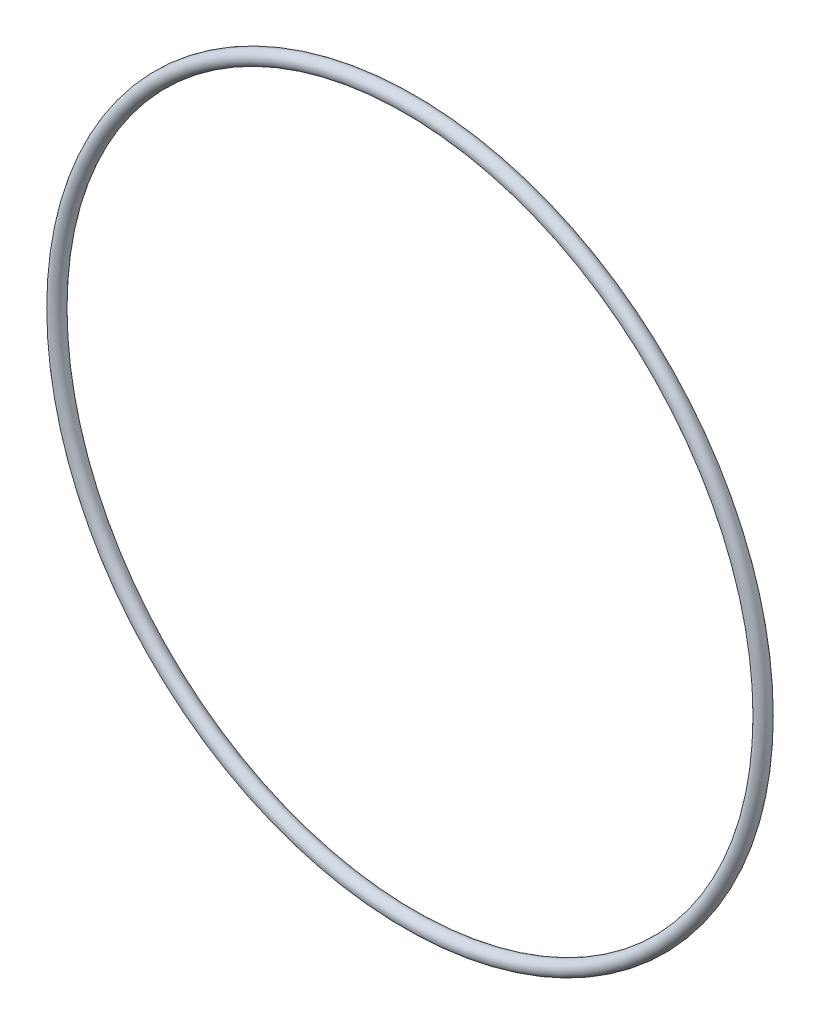
ISO-10303-21;
HEADER;
FILE_DESCRIPTION(('STEP AP214'),'2;1');
FILE_NAME('part.step','',(''),(''),'','','');
FILE_SCHEMA(('AUTOMOTIVE_DESIGN { 1 0 10303 214 1 1 1 1 }'));
ENDSEC;
DATA;
#1=APPLICATION_CONTEXT('core data for automotive mechanical design processes');
#2=APPLICATION_PROTOCOL_DEFINITION('international standard','automotive_design',2000,#1);
#3=PRODUCT_CONTEXT('',#1,'mechanical');
#4=PRODUCT('Part','Part','',(#3));
#5=PRODUCT_RELATED_PRODUCT_CATEGORY('part','',(#4));
#6=PRODUCT_DEFINITION_FORMATION('','',#4);
#7=PRODUCT_DEFINITION_CONTEXT('part definition',#1,'design');
#8=PRODUCT_DEFINITION('design','',#6,#7);
#9=PRODUCT_DEFINITION_SHAPE('','',#8);
#10=(LENGTH_UNIT() NAMED_UNIT(*) SI_UNIT(.MILLI.,.METRE.));
#11=(NAMED_UNIT(*) PLANE_ANGLE_UNIT() SI_UNIT($,.RADIAN.));
#12=(NAMED_UNIT(*) SI_UNIT($,.STERADIAN.) SOLID_ANGLE_UNIT());
#13=UNCERTAINTY_MEASURE_WITH_UNIT(LENGTH_MEASURE(1.E-05),#10,'distance_accuracy_value','');
#14=(GEOMETRIC_REPRESENTATION_CONTEXT(3) GLOBAL_UNCERTAINTY_ASSIGNED_CONTEXT((#13)) GLOBAL_UNIT_ASSIGNED_CONTEXT((#10,
#11,#12)) REPRESENTATION_CONTEXT('',''));
#15=CARTESIAN_POINT('',(0.,0.,0.));
#16=DIRECTION('',(0.,0.,1.));
#17=DIRECTION('',(1.,0.,0.));
#18=AXIS2_PLACEMENT_3D('',#15,#16,#17);
#19=CARTESIAN_POINT('',(0.,0.,0.));
#20=DIRECTION('',(0.,0.,-1.));
#21=DIRECTION('',(-1.,0.,0.));
#22=AXIS2_PLACEMENT_3D('',#19,#20,#21);
#23=TOROIDAL_SURFACE('',#22,73.75,1.5);
#24=CARTESIAN_POINT('',(-75.25,0.,0.));
#25=VERTEX_POINT('',#24);
#26=VERTEX_LOOP('',#25);
#27=FACE_BOUND('',#26,.T.);
#28=ADVANCED_FACE('F43',(#27),#23,.T.);
#29=CLOSED_SHELL('',(#28));
#30=MANIFOLD_SOLID_BREP('B2',#29);
#31=ADVANCED_BREP_SHAPE_REPRESENTATION('',(#18,#30),#14);
#32=SHAPE_DEFINITION_REPRESENTATION(#9,#31);
ENDSEC;
END-ISO-10303-21;
